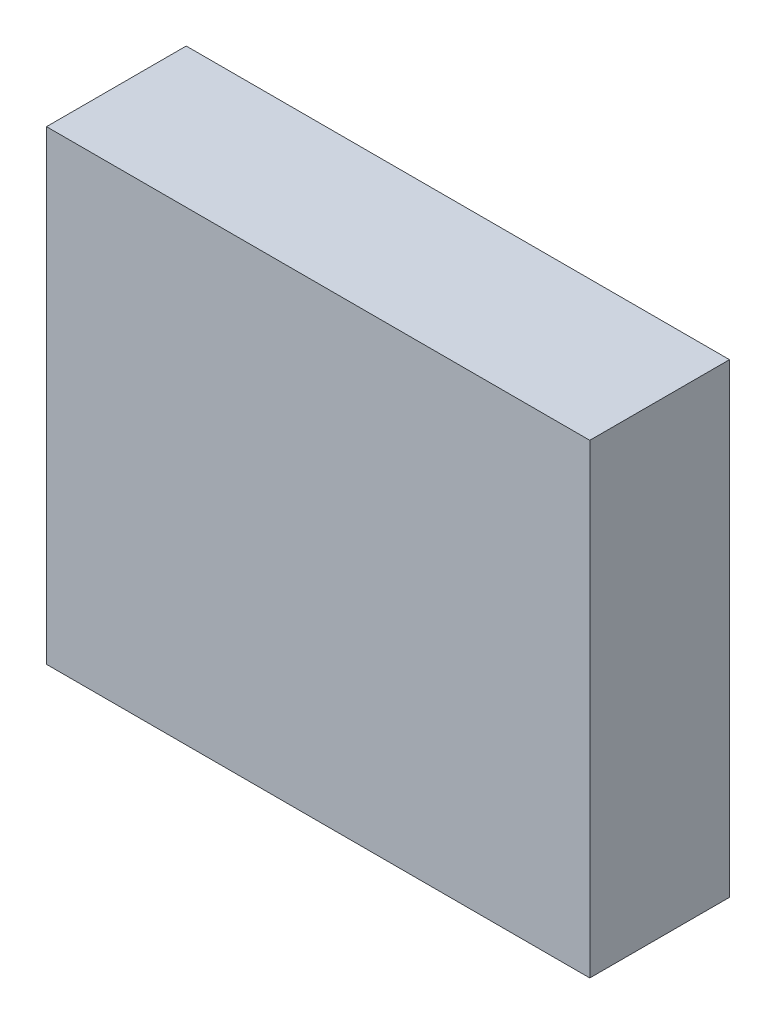
ISO-10303-21;
HEADER;
FILE_DESCRIPTION(('STEP AP214'),'2;1');
FILE_NAME('part.step','',(''),(''),'','','');
FILE_SCHEMA(('AUTOMOTIVE_DESIGN { 1 0 10303 214 1 1 1 1 }'));
ENDSEC;
DATA;
#1=APPLICATION_CONTEXT('core data for automotive mechanical design processes');
#2=APPLICATION_PROTOCOL_DEFINITION('international standard','automotive_design',2000,#1);
#3=PRODUCT_CONTEXT('',#1,'mechanical');
#4=PRODUCT('Part','Part','',(#3));
#5=PRODUCT_RELATED_PRODUCT_CATEGORY('part','',(#4));
#6=PRODUCT_DEFINITION_FORMATION('','',#4);
#7=PRODUCT_DEFINITION_CONTEXT('part definition',#1,'design');
#8=PRODUCT_DEFINITION('design','',#6,#7);
#9=PRODUCT_DEFINITION_SHAPE('','',#8);
#10=(LENGTH_UNIT() NAMED_UNIT(*) SI_UNIT(.MILLI.,.METRE.));
#11=(NAMED_UNIT(*) PLANE_ANGLE_UNIT() SI_UNIT($,.RADIAN.));
#12=(NAMED_UNIT(*) SI_UNIT($,.STERADIAN.) SOLID_ANGLE_UNIT());
#13=UNCERTAINTY_MEASURE_WITH_UNIT(LENGTH_MEASURE(1.E-05),#10,'distance_accuracy_value','');
#14=(GEOMETRIC_REPRESENTATION_CONTEXT(3) GLOBAL_UNCERTAINTY_ASSIGNED_CONTEXT((#13)) GLOBAL_UNIT_ASSIGNED_CONTEXT((#10,
#11,#12)) REPRESENTATION_CONTEXT('',''));
#15=CARTESIAN_POINT('',(0.,0.,0.));
#16=DIRECTION('',(0.,0.,1.));
#17=DIRECTION('',(1.,0.,0.));
#18=AXIS2_PLACEMENT_3D('',#15,#16,#17);
#19=CARTESIAN_POINT('',(0.,0.,18.));
#20=DIRECTION('',(1.,0.,0.));
#21=DIRECTION('',(0.,1.,0.));
#22=AXIS2_PLACEMENT_3D('',#19,#20,#21);
#23=PLANE('',#22);
#24=DIRECTION('',(0.,-1.,0.));
#25=VECTOR('',#24,1.);
#26=CARTESIAN_POINT('',(0.,0.,0.));
#27=LINE('',#26,#25);
#28=CARTESIAN_POINT('',(0.,0.,0.));
#29=VERTEX_POINT('',#28);
#30=CARTESIAN_POINT('',(0.,-60.,0.));
#31=VERTEX_POINT('',#30);
#32=EDGE_CURVE('E98',#29,#31,#27,.T.);
#33=ORIENTED_EDGE('',*,*,#32,.T.);
#34=DIRECTION('',(0.,0.,-1.));
#35=VECTOR('',#34,1.);
#36=CARTESIAN_POINT('',(0.,-60.,18.));
#37=LINE('',#36,#35);
#38=CARTESIAN_POINT('',(0.,-60.,18.));
#39=VERTEX_POINT('',#38);
#40=EDGE_CURVE('E11',#39,#31,#37,.T.);
#41=ORIENTED_EDGE('',*,*,#40,.F.);
#42=DIRECTION('',(0.,-1.,0.));
#43=VECTOR('',#42,1.);
#44=CARTESIAN_POINT('',(0.,0.,18.));
#45=LINE('',#44,#43);
#46=CARTESIAN_POINT('',(0.,0.,18.));
#47=VERTEX_POINT('',#46);
#48=EDGE_CURVE('E86',#47,#39,#45,.T.);
#49=ORIENTED_EDGE('',*,*,#48,.F.);
#50=DIRECTION('',(0.,0.,-1.));
#51=VECTOR('',#50,1.);
#52=CARTESIAN_POINT('',(0.,0.,18.));
#53=LINE('',#52,#51);
#54=EDGE_CURVE('E94',#47,#29,#53,.T.);
#55=ORIENTED_EDGE('',*,*,#54,.T.);
#56=EDGE_LOOP('',(#33,#41,#49,#55));
#57=FACE_BOUND('',#56,.T.);
#58=ADVANCED_FACE('F35',(#57),#23,.F.);
#59=CARTESIAN_POINT('',(0.,-60.,18.));
#60=DIRECTION('',(0.,1.,0.));
#61=DIRECTION('',(0.,0.,1.));
#62=AXIS2_PLACEMENT_3D('',#59,#60,#61);
#63=PLANE('',#62);
#64=DIRECTION('',(1.,0.,0.));
#65=VECTOR('',#64,1.);
#66=CARTESIAN_POINT('',(0.,-60.,0.));
#67=LINE('',#66,#65);
#68=CARTESIAN_POINT('',(70.,-60.,0.));
#69=VERTEX_POINT('',#68);
#70=EDGE_CURVE('E90',#31,#69,#67,.T.);
#71=ORIENTED_EDGE('',*,*,#70,.T.);
#72=DIRECTION('',(0.,0.,-1.));
#73=VECTOR('',#72,1.);
#74=CARTESIAN_POINT('',(70.,-60.,18.));
#75=LINE('',#74,#73);
#76=CARTESIAN_POINT('',(70.,-60.,18.));
#77=VERTEX_POINT('',#76);
#78=EDGE_CURVE('E43',#77,#69,#75,.T.);
#79=ORIENTED_EDGE('',*,*,#78,.F.);
#80=DIRECTION('',(1.,0.,0.));
#81=VECTOR('',#80,1.);
#82=CARTESIAN_POINT('',(0.,-60.,18.));
#83=LINE('',#82,#81);
#84=EDGE_CURVE('E81',#39,#77,#83,.T.);
#85=ORIENTED_EDGE('',*,*,#84,.F.);
#86=ORIENTED_EDGE('',*,*,#40,.T.);
#87=EDGE_LOOP('',(#71,#79,#85,#86));
#88=FACE_BOUND('',#87,.T.);
#89=ADVANCED_FACE('F89',(#88),#63,.F.);
#90=CARTESIAN_POINT('',(70.,0.,18.));
#91=DIRECTION('',(-1.,0.,0.));
#92=DIRECTION('',(0.,-1.,0.));
#93=AXIS2_PLACEMENT_3D('',#90,#91,#92);
#94=PLANE('',#93);
#95=DIRECTION('',(0.,1.,0.));
#96=VECTOR('',#95,1.);
#97=CARTESIAN_POINT('',(70.,0.,0.));
#98=LINE('',#97,#96);
#99=CARTESIAN_POINT('',(70.,0.,0.));
#100=VERTEX_POINT('',#99);
#101=EDGE_CURVE('E68',#69,#100,#98,.T.);
#102=ORIENTED_EDGE('',*,*,#101,.T.);
#103=DIRECTION('',(0.,0.,-1.));
#104=VECTOR('',#103,1.);
#105=CARTESIAN_POINT('',(70.,0.,18.));
#106=LINE('',#105,#104);
#107=CARTESIAN_POINT('',(70.,0.,18.));
#108=VERTEX_POINT('',#107);
#109=EDGE_CURVE('E91',#108,#100,#106,.T.);
#110=ORIENTED_EDGE('',*,*,#109,.F.);
#111=DIRECTION('',(0.,1.,0.));
#112=VECTOR('',#111,1.);
#113=CARTESIAN_POINT('',(70.,0.,18.));
#114=LINE('',#113,#112);
#115=EDGE_CURVE('E84',#77,#108,#114,.T.);
#116=ORIENTED_EDGE('',*,*,#115,.F.);
#117=ORIENTED_EDGE('',*,*,#78,.T.);
#118=EDGE_LOOP('',(#102,#110,#116,#117));
#119=FACE_BOUND('',#118,.T.);
#120=ADVANCED_FACE('F92',(#119),#94,.F.);
#121=CARTESIAN_POINT('',(0.,0.,18.));
#122=DIRECTION('',(0.,-1.,0.));
#123=DIRECTION('',(0.,0.,-1.));
#124=AXIS2_PLACEMENT_3D('',#121,#122,#123);
#125=PLANE('',#124);
#126=DIRECTION('',(-1.,0.,0.));
#127=VECTOR('',#126,1.);
#128=CARTESIAN_POINT('',(0.,0.,0.));
#129=LINE('',#128,#127);
#130=EDGE_CURVE('E74',#100,#29,#129,.T.);
#131=ORIENTED_EDGE('',*,*,#130,.T.);
#132=ORIENTED_EDGE('',*,*,#54,.F.);
#133=DIRECTION('',(-1.,0.,0.));
#134=VECTOR('',#133,1.);
#135=CARTESIAN_POINT('',(0.,0.,18.));
#136=LINE('',#135,#134);
#137=EDGE_CURVE('E51',#108,#47,#136,.T.);
#138=ORIENTED_EDGE('',*,*,#137,.F.);
#139=ORIENTED_EDGE('',*,*,#109,.T.);
#140=EDGE_LOOP('',(#131,#132,#138,#139));
#141=FACE_BOUND('',#140,.T.);
#142=ADVANCED_FACE('F105',(#141),#125,.F.);
#143=CARTESIAN_POINT('',(0.,0.,18.));
#144=DIRECTION('',(0.,0.,1.));
#145=DIRECTION('',(1.,0.,0.));
#146=AXIS2_PLACEMENT_3D('',#143,#144,#145);
#147=PLANE('',#146);
#148=ORIENTED_EDGE('',*,*,#48,.T.);
#149=ORIENTED_EDGE('',*,*,#84,.T.);
#150=ORIENTED_EDGE('',*,*,#115,.T.);
#151=ORIENTED_EDGE('',*,*,#137,.T.);
#152=EDGE_LOOP('',(#148,#149,#150,#151));
#153=FACE_BOUND('',#152,.T.);
#154=ADVANCED_FACE('F82',(#153),#147,.T.);
#155=CARTESIAN_POINT('',(0.,0.,0.));
#156=DIRECTION('',(0.,0.,1.));
#157=DIRECTION('',(1.,0.,0.));
#158=AXIS2_PLACEMENT_3D('',#155,#156,#157);
#159=PLANE('',#158);
#160=ORIENTED_EDGE('',*,*,#32,.F.);
#161=ORIENTED_EDGE('',*,*,#130,.F.);
#162=ORIENTED_EDGE('',*,*,#101,.F.);
#163=ORIENTED_EDGE('',*,*,#70,.F.);
#164=EDGE_LOOP('',(#160,#161,#162,#163));
#165=FACE_BOUND('',#164,.T.);
#166=ADVANCED_FACE('F108',(#165),#159,.F.);
#167=CLOSED_SHELL('',(#58,#89,#120,#142,#154,#166));
#168=MANIFOLD_SOLID_BREP('B2',#167);
#169=ADVANCED_BREP_SHAPE_REPRESENTATION('',(#18,#168),#14);
#170=SHAPE_DEFINITION_REPRESENTATION(#9,#169);
ENDSEC;
END-ISO-10303-21;
